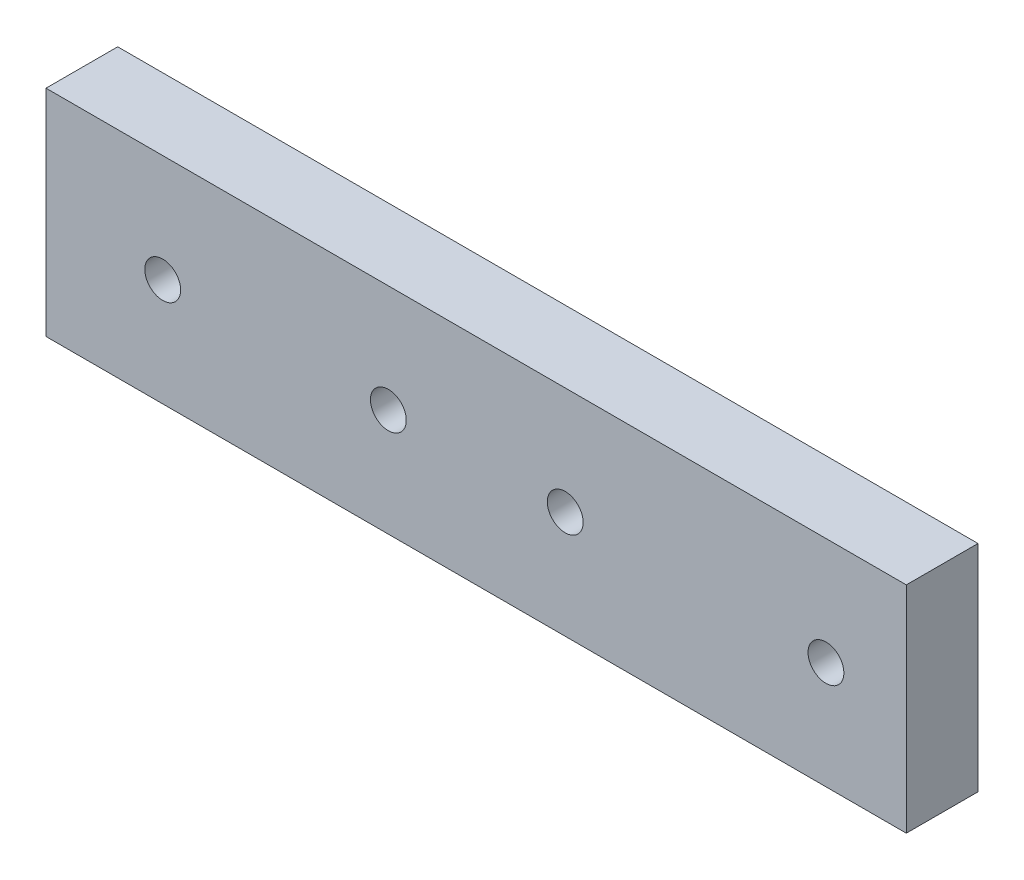
ISO-10303-21;
HEADER;
FILE_DESCRIPTION(('STEP AP214'),'2;1');
FILE_NAME('part.step','',(''),(''),'','','');
FILE_SCHEMA(('AUTOMOTIVE_DESIGN { 1 0 10303 214 1 1 1 1 }'));
ENDSEC;
DATA;
#1=APPLICATION_CONTEXT('core data for automotive mechanical design processes');
#2=APPLICATION_PROTOCOL_DEFINITION('international standard','automotive_design',2000,#1);
#3=PRODUCT_CONTEXT('',#1,'mechanical');
#4=PRODUCT('Part','Part','',(#3));
#5=PRODUCT_RELATED_PRODUCT_CATEGORY('part','',(#4));
#6=PRODUCT_DEFINITION_FORMATION('','',#4);
#7=PRODUCT_DEFINITION_CONTEXT('part definition',#1,'design');
#8=PRODUCT_DEFINITION('design','',#6,#7);
#9=PRODUCT_DEFINITION_SHAPE('','',#8);
#10=(LENGTH_UNIT() NAMED_UNIT(*) SI_UNIT(.MILLI.,.METRE.));
#11=(NAMED_UNIT(*) PLANE_ANGLE_UNIT() SI_UNIT($,.RADIAN.));
#12=(NAMED_UNIT(*) SI_UNIT($,.STERADIAN.) SOLID_ANGLE_UNIT());
#13=UNCERTAINTY_MEASURE_WITH_UNIT(LENGTH_MEASURE(1.E-05),#10,'distance_accuracy_value','');
#14=(GEOMETRIC_REPRESENTATION_CONTEXT(3) GLOBAL_UNCERTAINTY_ASSIGNED_CONTEXT((#13)) GLOBAL_UNIT_ASSIGNED_CONTEXT((#10,
#11,#12)) REPRESENTATION_CONTEXT('',''));
#15=CARTESIAN_POINT('',(0.,0.,0.));
#16=DIRECTION('',(0.,0.,1.));
#17=DIRECTION('',(1.,0.,0.));
#18=AXIS2_PLACEMENT_3D('',#15,#16,#17);
#19=CARTESIAN_POINT('',(-6.70657386989236,15.,40.));
#20=DIRECTION('',(0.,0.,-1.));
#21=DIRECTION('',(-1.,0.,0.));
#22=AXIS2_PLACEMENT_3D('',#19,#20,#21);
#23=CYLINDRICAL_SURFACE('',#22,2.5);
#24=CARTESIAN_POINT('',(-6.70657386989238,15.,-17.5));
#25=DIRECTION('',(0.,0.,-1.));
#26=DIRECTION('',(-1.,0.,0.));
#27=AXIS2_PLACEMENT_3D('',#24,#25,#26);
#28=CIRCLE('',#27,2.5);
#29=CARTESIAN_POINT('',(-9.20657386989238,15.,-17.5));
#30=VERTEX_POINT('',#29);
#31=EDGE_CURVE('E447',#30,#30,#28,.T.);
#32=ORIENTED_EDGE('',*,*,#31,.F.);
#33=EDGE_LOOP('',(#32));
#34=FACE_BOUND('',#33,.T.);
#35=CARTESIAN_POINT('',(-6.70657386989239,15.,-24.5));
#36=DIRECTION('',(0.,0.,-1.));
#37=DIRECTION('',(-1.,0.,0.));
#38=AXIS2_PLACEMENT_3D('',#35,#36,#37);
#39=CIRCLE('',#38,2.5);
#40=CARTESIAN_POINT('',(-9.20657386989239,15.,-24.5));
#41=VERTEX_POINT('',#40);
#42=EDGE_CURVE('E37',#41,#41,#39,.F.);
#43=ORIENTED_EDGE('',*,*,#42,.F.);
#44=EDGE_LOOP('',(#43));
#45=FACE_BOUND('',#44,.T.);
#46=ADVANCED_FACE('F33',(#34,#45),#23,.F.);
#47=CARTESIAN_POINT('',(-99.2164026591733,15.,40.));
#48=DIRECTION('',(0.,0.,-1.));
#49=DIRECTION('',(-1.,0.,0.));
#50=AXIS2_PLACEMENT_3D('',#47,#48,#49);
#51=CYLINDRICAL_SURFACE('',#50,2.5);
#52=CARTESIAN_POINT('',(-99.2164026591733,15.,-17.5));
#53=DIRECTION('',(0.,0.,-1.));
#54=DIRECTION('',(-1.,0.,0.));
#55=AXIS2_PLACEMENT_3D('',#52,#53,#54);
#56=CIRCLE('',#55,2.5);
#57=CARTESIAN_POINT('',(-101.716402659173,15.,-17.5));
#58=VERTEX_POINT('',#57);
#59=EDGE_CURVE('E450',#58,#58,#56,.T.);
#60=ORIENTED_EDGE('',*,*,#59,.F.);
#61=EDGE_LOOP('',(#60));
#62=FACE_BOUND('',#61,.T.);
#63=CARTESIAN_POINT('',(-99.2164026591734,15.,-24.5));
#64=DIRECTION('',(0.,0.,-1.));
#65=DIRECTION('',(-1.,0.,0.));
#66=AXIS2_PLACEMENT_3D('',#63,#64,#65);
#67=CIRCLE('',#66,2.5);
#68=CARTESIAN_POINT('',(-101.716402659173,15.,-24.5));
#69=VERTEX_POINT('',#68);
#70=EDGE_CURVE('E462',#69,#69,#67,.F.);
#71=ORIENTED_EDGE('',*,*,#70,.F.);
#72=EDGE_LOOP('',(#71));
#73=FACE_BOUND('',#72,.T.);
#74=ADVANCED_FACE('F472',(#62,#73),#51,.F.);
#75=CARTESIAN_POINT('',(-67.7461410245669,15.,40.));
#76=DIRECTION('',(0.,0.,-1.));
#77=DIRECTION('',(-1.,0.,0.));
#78=AXIS2_PLACEMENT_3D('',#75,#76,#77);
#79=CYLINDRICAL_SURFACE('',#78,2.50000000000001);
#80=CARTESIAN_POINT('',(-67.7461410245669,15.,-17.5));
#81=DIRECTION('',(0.,0.,-1.));
#82=DIRECTION('',(-1.,0.,0.));
#83=AXIS2_PLACEMENT_3D('',#80,#81,#82);
#84=CIRCLE('',#83,2.50000000000001);
#85=CARTESIAN_POINT('',(-70.2461410245669,15.,-17.5));
#86=VERTEX_POINT('',#85);
#87=EDGE_CURVE('E453',#86,#86,#84,.T.);
#88=ORIENTED_EDGE('',*,*,#87,.F.);
#89=EDGE_LOOP('',(#88));
#90=FACE_BOUND('',#89,.T.);
#91=CARTESIAN_POINT('',(-67.7461410245669,15.,-24.5));
#92=DIRECTION('',(0.,0.,-1.));
#93=DIRECTION('',(-1.,0.,0.));
#94=AXIS2_PLACEMENT_3D('',#91,#92,#93);
#95=CIRCLE('',#94,2.50000000000001);
#96=CARTESIAN_POINT('',(-70.2461410245669,15.,-24.5));
#97=VERTEX_POINT('',#96);
#98=EDGE_CURVE('E460',#97,#97,#95,.F.);
#99=ORIENTED_EDGE('',*,*,#98,.F.);
#100=EDGE_LOOP('',(#99));
#101=FACE_BOUND('',#100,.T.);
#102=ADVANCED_FACE('F478',(#90,#101),#79,.F.);
#103=CARTESIAN_POINT('',(-43.0740192619808,15.,40.));
#104=DIRECTION('',(0.,0.,-1.));
#105=DIRECTION('',(-1.,0.,0.));
#106=AXIS2_PLACEMENT_3D('',#103,#104,#105);
#107=CYLINDRICAL_SURFACE('',#106,2.5);
#108=CARTESIAN_POINT('',(-43.0740192619808,15.,-17.5));
#109=DIRECTION('',(0.,0.,-1.));
#110=DIRECTION('',(-1.,0.,0.));
#111=AXIS2_PLACEMENT_3D('',#108,#109,#110);
#112=CIRCLE('',#111,2.5);
#113=CARTESIAN_POINT('',(-45.5740192619808,15.,-17.5));
#114=VERTEX_POINT('',#113);
#115=EDGE_CURVE('E435',#114,#114,#112,.T.);
#116=ORIENTED_EDGE('',*,*,#115,.F.);
#117=EDGE_LOOP('',(#116));
#118=FACE_BOUND('',#117,.T.);
#119=CARTESIAN_POINT('',(-43.0740192619808,15.,-24.5));
#120=DIRECTION('',(0.,0.,-1.));
#121=DIRECTION('',(-1.,0.,0.));
#122=AXIS2_PLACEMENT_3D('',#119,#120,#121);
#123=CIRCLE('',#122,2.5);
#124=CARTESIAN_POINT('',(-45.5740192619808,15.,-24.5));
#125=VERTEX_POINT('',#124);
#126=EDGE_CURVE('E409',#125,#125,#123,.F.);
#127=ORIENTED_EDGE('',*,*,#126,.F.);
#128=EDGE_LOOP('',(#127));
#129=FACE_BOUND('',#128,.T.);
#130=ADVANCED_FACE('F506',(#118,#129),#107,.F.);
#131=CARTESIAN_POINT('',(-115.498945947558,0.,-27.5));
#132=DIRECTION('',(1.,0.,0.));
#133=DIRECTION('',(0.,0.,-1.));
#134=AXIS2_PLACEMENT_3D('',#131,#132,#133);
#135=PLANE('',#134);
#136=DIRECTION('',(0.,1.,0.));
#137=VECTOR('',#136,1.);
#138=CARTESIAN_POINT('',(-115.498945947558,0.,-17.5));
#139=LINE('',#138,#137);
#140=CARTESIAN_POINT('',(-115.498945947558,0.,-17.5));
#141=VERTEX_POINT('',#140);
#142=CARTESIAN_POINT('',(-115.498945947558,30.,-17.5));
#143=VERTEX_POINT('',#142);
#144=EDGE_CURVE('E431',#141,#143,#139,.T.);
#145=ORIENTED_EDGE('',*,*,#144,.T.);
#146=DIRECTION('',(0.,0.,1.));
#147=VECTOR('',#146,1.);
#148=CARTESIAN_POINT('',(-115.498945947558,30.,-27.5));
#149=LINE('',#148,#147);
#150=CARTESIAN_POINT('',(-115.498945947558,30.,-27.5));
#151=VERTEX_POINT('',#150);
#152=EDGE_CURVE('E11',#151,#143,#149,.T.);
#153=ORIENTED_EDGE('',*,*,#152,.F.);
#154=DIRECTION('',(0.,1.,0.));
#155=VECTOR('',#154,1.);
#156=CARTESIAN_POINT('',(-115.498945947558,0.,-27.5));
#157=LINE('',#156,#155);
#158=CARTESIAN_POINT('',(-115.498945947558,0.,-27.5));
#159=VERTEX_POINT('',#158);
#160=EDGE_CURVE('E420',#159,#151,#157,.T.);
#161=ORIENTED_EDGE('',*,*,#160,.F.);
#162=DIRECTION('',(0.,0.,1.));
#163=VECTOR('',#162,1.);
#164=CARTESIAN_POINT('',(-115.498945947558,0.,-27.5));
#165=LINE('',#164,#163);
#166=EDGE_CURVE('E430',#159,#141,#165,.T.);
#167=ORIENTED_EDGE('',*,*,#166,.T.);
#168=EDGE_LOOP('',(#145,#153,#161,#167));
#169=FACE_BOUND('',#168,.T.);
#170=ADVANCED_FACE('F35',(#169),#135,.F.);
#171=CARTESIAN_POINT('',(-115.498945947558,30.,-27.5));
#172=DIRECTION('',(0.,-1.,0.));
#173=DIRECTION('',(0.,0.,-1.));
#174=AXIS2_PLACEMENT_3D('',#171,#172,#173);
#175=PLANE('',#174);
#176=DIRECTION('',(1.,0.,0.));
#177=VECTOR('',#176,1.);
#178=CARTESIAN_POINT('',(-115.498945947558,30.,-17.5));
#179=LINE('',#178,#177);
#180=CARTESIAN_POINT('',(4.50105405244177,30.,-17.5));
#181=VERTEX_POINT('',#180);
#182=EDGE_CURVE('E434',#143,#181,#179,.T.);
#183=ORIENTED_EDGE('',*,*,#182,.T.);
#184=DIRECTION('',(0.,0.,1.));
#185=VECTOR('',#184,1.);
#186=CARTESIAN_POINT('',(4.50105405244176,30.,-27.5));
#187=LINE('',#186,#185);
#188=CARTESIAN_POINT('',(4.50105405244176,30.,-27.5));
#189=VERTEX_POINT('',#188);
#190=EDGE_CURVE('E42',#189,#181,#187,.T.);
#191=ORIENTED_EDGE('',*,*,#190,.F.);
#192=DIRECTION('',(1.,0.,0.));
#193=VECTOR('',#192,1.);
#194=CARTESIAN_POINT('',(-115.498945947558,30.,-27.5));
#195=LINE('',#194,#193);
#196=EDGE_CURVE('E423',#151,#189,#195,.T.);
#197=ORIENTED_EDGE('',*,*,#196,.F.);
#198=ORIENTED_EDGE('',*,*,#152,.T.);
#199=EDGE_LOOP('',(#183,#191,#197,#198));
#200=FACE_BOUND('',#199,.T.);
#201=ADVANCED_FACE('F499',(#200),#175,.F.);
#202=CARTESIAN_POINT('',(4.50105405244176,30.,-27.5));
#203=DIRECTION('',(-1.,0.,0.));
#204=DIRECTION('',(0.,0.,1.));
#205=AXIS2_PLACEMENT_3D('',#202,#203,#204);
#206=PLANE('',#205);
#207=DIRECTION('',(0.,-1.,0.));
#208=VECTOR('',#207,1.);
#209=CARTESIAN_POINT('',(4.50105405244177,30.,-17.5));
#210=LINE('',#209,#208);
#211=CARTESIAN_POINT('',(4.50105405244177,0.,-17.5));
#212=VERTEX_POINT('',#211);
#213=EDGE_CURVE('E437',#181,#212,#210,.T.);
#214=ORIENTED_EDGE('',*,*,#213,.T.);
#215=DIRECTION('',(0.,0.,1.));
#216=VECTOR('',#215,1.);
#217=CARTESIAN_POINT('',(4.50105405244176,0.,-27.5));
#218=LINE('',#217,#216);
#219=CARTESIAN_POINT('',(4.50105405244176,0.,-27.5));
#220=VERTEX_POINT('',#219);
#221=EDGE_CURVE('E442',#220,#212,#218,.T.);
#222=ORIENTED_EDGE('',*,*,#221,.F.);
#223=DIRECTION('',(0.,-1.,0.));
#224=VECTOR('',#223,1.);
#225=CARTESIAN_POINT('',(4.50105405244176,30.,-27.5));
#226=LINE('',#225,#224);
#227=EDGE_CURVE('E426',#189,#220,#226,.T.);
#228=ORIENTED_EDGE('',*,*,#227,.F.);
#229=ORIENTED_EDGE('',*,*,#190,.T.);
#230=EDGE_LOOP('',(#214,#222,#228,#229));
#231=FACE_BOUND('',#230,.T.);
#232=ADVANCED_FACE('F496',(#231),#206,.F.);
#233=CARTESIAN_POINT('',(4.50105405244176,0.,-27.5));
#234=DIRECTION('',(0.,1.,0.));
#235=DIRECTION('',(-1.,0.,0.));
#236=AXIS2_PLACEMENT_3D('',#233,#234,#235);
#237=PLANE('',#236);
#238=DIRECTION('',(-1.,0.,0.));
#239=VECTOR('',#238,1.);
#240=CARTESIAN_POINT('',(4.50105405244177,0.,-17.5));
#241=LINE('',#240,#239);
#242=EDGE_CURVE('E424',#212,#141,#241,.T.);
#243=ORIENTED_EDGE('',*,*,#242,.T.);
#244=ORIENTED_EDGE('',*,*,#166,.F.);
#245=DIRECTION('',(-1.,0.,0.));
#246=VECTOR('',#245,1.);
#247=CARTESIAN_POINT('',(4.50105405244176,0.,-27.5));
#248=LINE('',#247,#246);
#249=EDGE_CURVE('E428',#220,#159,#248,.T.);
#250=ORIENTED_EDGE('',*,*,#249,.F.);
#251=ORIENTED_EDGE('',*,*,#221,.T.);
#252=EDGE_LOOP('',(#243,#244,#250,#251));
#253=FACE_BOUND('',#252,.T.);
#254=ADVANCED_FACE('F488',(#253),#237,.F.);
#255=CARTESIAN_POINT('',(0.,0.,-27.5));
#256=DIRECTION('',(0.,0.,-1.));
#257=DIRECTION('',(-1.,0.,0.));
#258=AXIS2_PLACEMENT_3D('',#255,#256,#257);
#259=PLANE('',#258);
#260=DIRECTION('',(-1.,0.,0.));
#261=VECTOR('',#260,1.);
#262=CARTESIAN_POINT('',(-96.8492665554959,10.9,-27.5));
#263=LINE('',#262,#261);
#264=CARTESIAN_POINT('',(-96.8492665554959,10.9,-27.5));
#265=VERTEX_POINT('',#264);
#266=CARTESIAN_POINT('',(-101.583538762851,10.9,-27.5));
#267=VERTEX_POINT('',#266);
#268=EDGE_CURVE('E50',#265,#267,#263,.T.);
#269=ORIENTED_EDGE('',*,*,#268,.F.);
#270=DIRECTION('',(-0.499999999999999,-0.866025403784439,0.));
#271=VECTOR('',#270,1.);
#272=CARTESIAN_POINT('',(-94.4821304518184,15.,-27.5));
#273=LINE('',#272,#271);
#274=CARTESIAN_POINT('',(-94.4821304518184,15.,-27.5));
#275=VERTEX_POINT('',#274);
#276=EDGE_CURVE('E331',#275,#265,#273,.T.);
#277=ORIENTED_EDGE('',*,*,#276,.F.);
#278=DIRECTION('',(0.500000000000002,-0.866025403784438,0.));
#279=VECTOR('',#278,1.);
#280=CARTESIAN_POINT('',(-96.8492665554959,19.1,-27.5));
#281=LINE('',#280,#279);
#282=CARTESIAN_POINT('',(-96.8492665554959,19.1,-27.5));
#283=VERTEX_POINT('',#282);
#284=EDGE_CURVE('E357',#283,#275,#281,.T.);
#285=ORIENTED_EDGE('',*,*,#284,.F.);
#286=DIRECTION('',(1.,0.,0.));
#287=VECTOR('',#286,1.);
#288=CARTESIAN_POINT('',(-101.583538762851,19.1,-27.5));
#289=LINE('',#288,#287);
#290=CARTESIAN_POINT('',(-101.583538762851,19.1,-27.5));
#291=VERTEX_POINT('',#290);
#292=EDGE_CURVE('E354',#291,#283,#289,.T.);
#293=ORIENTED_EDGE('',*,*,#292,.F.);
#294=DIRECTION('',(0.500000000000001,0.866025403784438,0.));
#295=VECTOR('',#294,1.);
#296=CARTESIAN_POINT('',(-103.950674866528,15.,-27.5));
#297=LINE('',#296,#295);
#298=CARTESIAN_POINT('',(-103.950674866528,15.,-27.5));
#299=VERTEX_POINT('',#298);
#300=EDGE_CURVE('E351',#299,#291,#297,.T.);
#301=ORIENTED_EDGE('',*,*,#300,.F.);
#302=DIRECTION('',(-0.500000000000002,0.866025403784437,0.));
#303=VECTOR('',#302,1.);
#304=CARTESIAN_POINT('',(-101.583538762851,10.9,-27.5));
#305=LINE('',#304,#303);
#306=EDGE_CURVE('E348',#267,#299,#305,.T.);
#307=ORIENTED_EDGE('',*,*,#306,.F.);
#308=EDGE_LOOP('',(#269,#277,#285,#293,#301,#307));
#309=FACE_BOUND('',#308,.T.);
#310=DIRECTION('',(-1.,0.,0.));
#311=VECTOR('',#310,1.);
#312=CARTESIAN_POINT('',(-4.33943776621493,10.9,-27.5));
#313=LINE('',#312,#311);
#314=CARTESIAN_POINT('',(-4.33943776621493,10.9,-27.5));
#315=VERTEX_POINT('',#314);
#316=CARTESIAN_POINT('',(-9.07370997356985,10.9,-27.5));
#317=VERTEX_POINT('',#316);
#318=EDGE_CURVE('E58',#315,#317,#313,.T.);
#319=ORIENTED_EDGE('',*,*,#318,.F.);
#320=DIRECTION('',(-0.5,-0.866025403784439,0.));
#321=VECTOR('',#320,1.);
#322=CARTESIAN_POINT('',(-1.97230166253746,15.,-27.5));
#323=LINE('',#322,#321);
#324=CARTESIAN_POINT('',(-1.97230166253746,15.,-27.5));
#325=VERTEX_POINT('',#324);
#326=EDGE_CURVE('E285',#325,#315,#323,.T.);
#327=ORIENTED_EDGE('',*,*,#326,.F.);
#328=DIRECTION('',(0.500000000000001,-0.866025403784438,0.));
#329=VECTOR('',#328,1.);
#330=CARTESIAN_POINT('',(-4.33943776621493,19.1,-27.5));
#331=LINE('',#330,#329);
#332=CARTESIAN_POINT('',(-4.33943776621493,19.1,-27.5));
#333=VERTEX_POINT('',#332);
#334=EDGE_CURVE('E312',#333,#325,#331,.T.);
#335=ORIENTED_EDGE('',*,*,#334,.F.);
#336=DIRECTION('',(1.,0.,0.));
#337=VECTOR('',#336,1.);
#338=CARTESIAN_POINT('',(-9.07370997356985,19.1,-27.5));
#339=LINE('',#338,#337);
#340=CARTESIAN_POINT('',(-9.07370997356985,19.1,-27.5));
#341=VERTEX_POINT('',#340);
#342=EDGE_CURVE('E309',#341,#333,#339,.T.);
#343=ORIENTED_EDGE('',*,*,#342,.F.);
#344=DIRECTION('',(0.5,0.866025403784439,0.));
#345=VECTOR('',#344,1.);
#346=CARTESIAN_POINT('',(-11.4408460772473,15.,-27.5));
#347=LINE('',#346,#345);
#348=CARTESIAN_POINT('',(-11.4408460772473,15.,-27.5));
#349=VERTEX_POINT('',#348);
#350=EDGE_CURVE('E306',#349,#341,#347,.T.);
#351=ORIENTED_EDGE('',*,*,#350,.F.);
#352=DIRECTION('',(-0.500000000000001,0.866025403784438,0.));
#353=VECTOR('',#352,1.);
#354=CARTESIAN_POINT('',(-9.07370997356985,10.9,-27.5));
#355=LINE('',#354,#353);
#356=EDGE_CURVE('E302',#317,#349,#355,.T.);
#357=ORIENTED_EDGE('',*,*,#356,.F.);
#358=EDGE_LOOP('',(#319,#327,#335,#343,#351,#357));
#359=FACE_BOUND('',#358,.T.);
#360=DIRECTION('',(-1.,0.,0.));
#361=VECTOR('',#360,1.);
#362=CARTESIAN_POINT('',(-65.3790049208895,10.9,-27.5));
#363=LINE('',#362,#361);
#364=CARTESIAN_POINT('',(-65.3790049208895,10.9,-27.5));
#365=VERTEX_POINT('',#364);
#366=CARTESIAN_POINT('',(-70.1132771282444,10.9,-27.5));
#367=VERTEX_POINT('',#366);
#368=EDGE_CURVE('E227',#365,#367,#363,.T.);
#369=ORIENTED_EDGE('',*,*,#368,.F.);
#370=DIRECTION('',(-0.500000000000001,-0.866025403784438,0.));
#371=VECTOR('',#370,1.);
#372=CARTESIAN_POINT('',(-63.011868817212,15.,-27.5));
#373=LINE('',#372,#371);
#374=CARTESIAN_POINT('',(-63.011868817212,15.,-27.5));
#375=VERTEX_POINT('',#374);
#376=EDGE_CURVE('E246',#375,#365,#373,.T.);
#377=ORIENTED_EDGE('',*,*,#376,.F.);
#378=DIRECTION('',(0.500000000000001,-0.866025403784438,0.));
#379=VECTOR('',#378,1.);
#380=CARTESIAN_POINT('',(-65.3790049208895,19.1,-27.5));
#381=LINE('',#380,#379);
#382=CARTESIAN_POINT('',(-65.3790049208895,19.1,-27.5));
#383=VERTEX_POINT('',#382);
#384=EDGE_CURVE('E249',#383,#375,#381,.T.);
#385=ORIENTED_EDGE('',*,*,#384,.F.);
#386=DIRECTION('',(1.,0.,0.));
#387=VECTOR('',#386,1.);
#388=CARTESIAN_POINT('',(-70.1132771282443,19.1,-27.5));
#389=LINE('',#388,#387);
#390=CARTESIAN_POINT('',(-70.1132771282443,19.1,-27.5));
#391=VERTEX_POINT('',#390);
#392=EDGE_CURVE('E266',#391,#383,#389,.T.);
#393=ORIENTED_EDGE('',*,*,#392,.F.);
#394=DIRECTION('',(0.5,0.866025403784438,0.));
#395=VECTOR('',#394,1.);
#396=CARTESIAN_POINT('',(-72.4804132319218,15.,-27.5));
#397=LINE('',#396,#395);
#398=CARTESIAN_POINT('',(-72.4804132319218,15.,-27.5));
#399=VERTEX_POINT('',#398);
#400=EDGE_CURVE('E263',#399,#391,#397,.T.);
#401=ORIENTED_EDGE('',*,*,#400,.F.);
#402=DIRECTION('',(-0.5,0.866025403784439,0.));
#403=VECTOR('',#402,1.);
#404=CARTESIAN_POINT('',(-70.1132771282444,10.9,-27.5));
#405=LINE('',#404,#403);
#406=EDGE_CURVE('E260',#367,#399,#405,.T.);
#407=ORIENTED_EDGE('',*,*,#406,.F.);
#408=EDGE_LOOP('',(#369,#377,#385,#393,#401,#407));
#409=FACE_BOUND('',#408,.T.);
#410=DIRECTION('',(-1.,0.,0.));
#411=VECTOR('',#410,1.);
#412=CARTESIAN_POINT('',(-40.7068831583033,10.9,-27.5));
#413=LINE('',#412,#411);
#414=CARTESIAN_POINT('',(-40.7068831583033,10.9,-27.5));
#415=VERTEX_POINT('',#414);
#416=CARTESIAN_POINT('',(-45.4411553656583,10.9,-27.5));
#417=VERTEX_POINT('',#416);
#418=EDGE_CURVE('E273',#415,#417,#413,.T.);
#419=ORIENTED_EDGE('',*,*,#418,.F.);
#420=DIRECTION('',(-0.499999999999999,-0.866025403784439,0.));
#421=VECTOR('',#420,1.);
#422=CARTESIAN_POINT('',(-38.3397470546259,15.,-27.5));
#423=LINE('',#422,#421);
#424=CARTESIAN_POINT('',(-38.3397470546259,15.,-27.5));
#425=VERTEX_POINT('',#424);
#426=EDGE_CURVE('E376',#425,#415,#423,.T.);
#427=ORIENTED_EDGE('',*,*,#426,.F.);
#428=DIRECTION('',(0.5,-0.866025403784439,0.));
#429=VECTOR('',#428,1.);
#430=CARTESIAN_POINT('',(-40.7068831583033,19.1,-27.5));
#431=LINE('',#430,#429);
#432=CARTESIAN_POINT('',(-40.7068831583033,19.1,-27.5));
#433=VERTEX_POINT('',#432);
#434=EDGE_CURVE('E402',#433,#425,#431,.T.);
#435=ORIENTED_EDGE('',*,*,#434,.F.);
#436=DIRECTION('',(1.,0.,0.));
#437=VECTOR('',#436,1.);
#438=CARTESIAN_POINT('',(-45.4411553656583,19.1,-27.5));
#439=LINE('',#438,#437);
#440=CARTESIAN_POINT('',(-45.4411553656583,19.1,-27.5));
#441=VERTEX_POINT('',#440);
#442=EDGE_CURVE('E399',#441,#433,#439,.T.);
#443=ORIENTED_EDGE('',*,*,#442,.F.);
#444=DIRECTION('',(0.500000000000001,0.866025403784438,0.));
#445=VECTOR('',#444,1.);
#446=CARTESIAN_POINT('',(-47.8082914693357,15.,-27.5));
#447=LINE('',#446,#445);
#448=CARTESIAN_POINT('',(-47.8082914693357,15.,-27.5));
#449=VERTEX_POINT('',#448);
#450=EDGE_CURVE('E396',#449,#441,#447,.T.);
#451=ORIENTED_EDGE('',*,*,#450,.F.);
#452=DIRECTION('',(-0.5,0.866025403784438,0.));
#453=VECTOR('',#452,1.);
#454=CARTESIAN_POINT('',(-45.4411553656583,10.9,-27.5));
#455=LINE('',#454,#453);
#456=EDGE_CURVE('E393',#417,#449,#455,.T.);
#457=ORIENTED_EDGE('',*,*,#456,.F.);
#458=EDGE_LOOP('',(#419,#427,#435,#443,#451,#457));
#459=FACE_BOUND('',#458,.T.);
#460=ORIENTED_EDGE('',*,*,#160,.T.);
#461=ORIENTED_EDGE('',*,*,#196,.T.);
#462=ORIENTED_EDGE('',*,*,#227,.T.);
#463=ORIENTED_EDGE('',*,*,#249,.T.);
#464=EDGE_LOOP('',(#460,#461,#462,#463));
#465=FACE_BOUND('',#464,.T.);
#466=ADVANCED_FACE('F484',(#309,#359,#409,#459,#465),#259,.T.);
#467=CARTESIAN_POINT('',(0.,0.,-17.5));
#468=DIRECTION('',(0.,0.,-1.));
#469=DIRECTION('',(-1.,0.,0.));
#470=AXIS2_PLACEMENT_3D('',#467,#468,#469);
#471=PLANE('',#470);
#472=ORIENTED_EDGE('',*,*,#115,.T.);
#473=EDGE_LOOP('',(#472));
#474=FACE_BOUND('',#473,.T.);
#475=ORIENTED_EDGE('',*,*,#87,.T.);
#476=EDGE_LOOP('',(#475));
#477=FACE_BOUND('',#476,.T.);
#478=ORIENTED_EDGE('',*,*,#59,.T.);
#479=EDGE_LOOP('',(#478));
#480=FACE_BOUND('',#479,.T.);
#481=ORIENTED_EDGE('',*,*,#31,.T.);
#482=EDGE_LOOP('',(#481));
#483=FACE_BOUND('',#482,.T.);
#484=ORIENTED_EDGE('',*,*,#144,.F.);
#485=ORIENTED_EDGE('',*,*,#242,.F.);
#486=ORIENTED_EDGE('',*,*,#213,.F.);
#487=ORIENTED_EDGE('',*,*,#182,.F.);
#488=EDGE_LOOP('',(#484,#485,#486,#487));
#489=FACE_BOUND('',#488,.T.);
#490=ADVANCED_FACE('F487',(#474,#477,#480,#483,#489),#471,.F.);
#491=CARTESIAN_POINT('',(0.,0.,-24.5000000000001));
#492=DIRECTION('',(0.,0.,-1.));
#493=DIRECTION('',(-1.,0.,0.));
#494=AXIS2_PLACEMENT_3D('',#491,#492,#493);
#495=PLANE('',#494);
#496=DIRECTION('',(-1.,0.,0.));
#497=VECTOR('',#496,1.);
#498=CARTESIAN_POINT('',(-40.7068831583033,10.9,-24.5));
#499=LINE('',#498,#497);
#500=CARTESIAN_POINT('',(-40.7068831583033,10.9,-24.5));
#501=VERTEX_POINT('',#500);
#502=CARTESIAN_POINT('',(-45.4411553656583,10.9,-24.5));
#503=VERTEX_POINT('',#502);
#504=EDGE_CURVE('E372',#501,#503,#499,.T.);
#505=ORIENTED_EDGE('',*,*,#504,.T.);
#506=DIRECTION('',(-0.5,0.866025403784438,0.));
#507=VECTOR('',#506,1.);
#508=CARTESIAN_POINT('',(-45.4411553656583,10.9,-24.5));
#509=LINE('',#508,#507);
#510=CARTESIAN_POINT('',(-47.8082914693357,15.,-24.5));
#511=VERTEX_POINT('',#510);
#512=EDGE_CURVE('E375',#503,#511,#509,.T.);
#513=ORIENTED_EDGE('',*,*,#512,.T.);
#514=DIRECTION('',(0.500000000000001,0.866025403784438,0.));
#515=VECTOR('',#514,1.);
#516=CARTESIAN_POINT('',(-47.8082914693357,15.,-24.5));
#517=LINE('',#516,#515);
#518=CARTESIAN_POINT('',(-45.4411553656583,19.1,-24.5));
#519=VERTEX_POINT('',#518);
#520=EDGE_CURVE('E379',#511,#519,#517,.T.);
#521=ORIENTED_EDGE('',*,*,#520,.T.);
#522=DIRECTION('',(1.,0.,0.));
#523=VECTOR('',#522,1.);
#524=CARTESIAN_POINT('',(-45.4411553656583,19.1,-24.5));
#525=LINE('',#524,#523);
#526=CARTESIAN_POINT('',(-40.7068831583033,19.1,-24.5));
#527=VERTEX_POINT('',#526);
#528=EDGE_CURVE('E382',#519,#527,#525,.T.);
#529=ORIENTED_EDGE('',*,*,#528,.T.);
#530=DIRECTION('',(0.5,-0.866025403784439,0.));
#531=VECTOR('',#530,1.);
#532=CARTESIAN_POINT('',(-40.7068831583033,19.1,-24.5));
#533=LINE('',#532,#531);
#534=CARTESIAN_POINT('',(-38.3397470546259,15.,-24.5));
#535=VERTEX_POINT('',#534);
#536=EDGE_CURVE('E385',#527,#535,#533,.T.);
#537=ORIENTED_EDGE('',*,*,#536,.T.);
#538=DIRECTION('',(-0.499999999999999,-0.866025403784439,0.));
#539=VECTOR('',#538,1.);
#540=CARTESIAN_POINT('',(-38.3397470546259,15.,-24.5));
#541=LINE('',#540,#539);
#542=EDGE_CURVE('E388',#535,#501,#541,.T.);
#543=ORIENTED_EDGE('',*,*,#542,.T.);
#544=EDGE_LOOP('',(#505,#513,#521,#529,#537,#543));
#545=FACE_BOUND('',#544,.T.);
#546=ORIENTED_EDGE('',*,*,#126,.T.);
#547=EDGE_LOOP('',(#546));
#548=FACE_BOUND('',#547,.T.);
#549=ADVANCED_FACE('F492',(#545,#548),#495,.T.);
#550=CARTESIAN_POINT('',(-40.7068831583033,10.9,-24.5));
#551=DIRECTION('',(0.,-1.,0.));
#552=DIRECTION('',(0.,0.,-1.));
#553=AXIS2_PLACEMENT_3D('',#550,#551,#552);
#554=PLANE('',#553);
#555=ORIENTED_EDGE('',*,*,#418,.T.);
#556=DIRECTION('',(0.,0.,-1.));
#557=VECTOR('',#556,1.);
#558=CARTESIAN_POINT('',(-45.4411553656583,10.9,-24.5));
#559=LINE('',#558,#557);
#560=EDGE_CURVE('E391',#503,#417,#559,.T.);
#561=ORIENTED_EDGE('',*,*,#560,.F.);
#562=ORIENTED_EDGE('',*,*,#504,.F.);
#563=DIRECTION('',(0.,0.,-1.));
#564=VECTOR('',#563,1.);
#565=CARTESIAN_POINT('',(-40.7068831583033,10.9,-24.5));
#566=LINE('',#565,#564);
#567=EDGE_CURVE('E407',#501,#415,#566,.T.);
#568=ORIENTED_EDGE('',*,*,#567,.T.);
#569=EDGE_LOOP('',(#555,#561,#562,#568));
#570=FACE_BOUND('',#569,.T.);
#571=ADVANCED_FACE('F532',(#570),#554,.F.);
#572=CARTESIAN_POINT('',(-38.3397470546259,15.,-24.5));
#573=DIRECTION('',(0.866025403784439,-0.499999999999999,0.));
#574=DIRECTION('',(0.499999999999999,0.866025403784439,0.));
#575=AXIS2_PLACEMENT_3D('',#572,#573,#574);
#576=PLANE('',#575);
#577=ORIENTED_EDGE('',*,*,#426,.T.);
#578=ORIENTED_EDGE('',*,*,#567,.F.);
#579=ORIENTED_EDGE('',*,*,#542,.F.);
#580=DIRECTION('',(0.,0.,-1.));
#581=VECTOR('',#580,1.);
#582=CARTESIAN_POINT('',(-38.3397470546259,15.,-24.5));
#583=LINE('',#582,#581);
#584=EDGE_CURVE('E410',#535,#425,#583,.T.);
#585=ORIENTED_EDGE('',*,*,#584,.T.);
#586=EDGE_LOOP('',(#577,#578,#579,#585));
#587=FACE_BOUND('',#586,.T.);
#588=ADVANCED_FACE('F535',(#587),#576,.F.);
#589=CARTESIAN_POINT('',(-40.7068831583033,19.1,-24.5));
#590=DIRECTION('',(0.866025403784439,0.5,0.));
#591=DIRECTION('',(-0.5,0.866025403784439,0.));
#592=AXIS2_PLACEMENT_3D('',#589,#590,#591);
#593=PLANE('',#592);
#594=ORIENTED_EDGE('',*,*,#434,.T.);
#595=ORIENTED_EDGE('',*,*,#584,.F.);
#596=ORIENTED_EDGE('',*,*,#536,.F.);
#597=DIRECTION('',(0.,0.,-1.));
#598=VECTOR('',#597,1.);
#599=CARTESIAN_POINT('',(-40.7068831583033,19.1,-24.5));
#600=LINE('',#599,#598);
#601=EDGE_CURVE('E412',#527,#433,#600,.T.);
#602=ORIENTED_EDGE('',*,*,#601,.T.);
#603=EDGE_LOOP('',(#594,#595,#596,#602));
#604=FACE_BOUND('',#603,.T.);
#605=ADVANCED_FACE('F548',(#604),#593,.F.);
#606=CARTESIAN_POINT('',(-45.4411553656583,19.1,-24.5));
#607=DIRECTION('',(0.,1.,0.));
#608=DIRECTION('',(0.,0.,1.));
#609=AXIS2_PLACEMENT_3D('',#606,#607,#608);
#610=PLANE('',#609);
#611=ORIENTED_EDGE('',*,*,#442,.T.);
#612=ORIENTED_EDGE('',*,*,#601,.F.);
#613=ORIENTED_EDGE('',*,*,#528,.F.);
#614=DIRECTION('',(0.,0.,-1.));
#615=VECTOR('',#614,1.);
#616=CARTESIAN_POINT('',(-45.4411553656583,19.1,-24.5));
#617=LINE('',#616,#615);
#618=EDGE_CURVE('E414',#519,#441,#617,.T.);
#619=ORIENTED_EDGE('',*,*,#618,.T.);
#620=EDGE_LOOP('',(#611,#612,#613,#619));
#621=FACE_BOUND('',#620,.T.);
#622=ADVANCED_FACE('F544',(#621),#610,.F.);
#623=CARTESIAN_POINT('',(-47.8082914693357,15.,-24.5));
#624=DIRECTION('',(-0.866025403784438,0.500000000000001,0.));
#625=DIRECTION('',(-0.500000000000001,-0.866025403784438,0.));
#626=AXIS2_PLACEMENT_3D('',#623,#624,#625);
#627=PLANE('',#626);
#628=ORIENTED_EDGE('',*,*,#450,.T.);
#629=ORIENTED_EDGE('',*,*,#618,.F.);
#630=ORIENTED_EDGE('',*,*,#520,.F.);
#631=DIRECTION('',(0.,0.,-1.));
#632=VECTOR('',#631,1.);
#633=CARTESIAN_POINT('',(-47.8082914693357,15.,-24.5));
#634=LINE('',#633,#632);
#635=EDGE_CURVE('E416',#511,#449,#634,.T.);
#636=ORIENTED_EDGE('',*,*,#635,.T.);
#637=EDGE_LOOP('',(#628,#629,#630,#636));
#638=FACE_BOUND('',#637,.T.);
#639=ADVANCED_FACE('F540',(#638),#627,.F.);
#640=CARTESIAN_POINT('',(-45.4411553656583,10.9,-24.5));
#641=DIRECTION('',(-0.866025403784438,-0.5,0.));
#642=DIRECTION('',(0.5,-0.866025403784438,0.));
#643=AXIS2_PLACEMENT_3D('',#640,#641,#642);
#644=PLANE('',#643);
#645=ORIENTED_EDGE('',*,*,#456,.T.);
#646=ORIENTED_EDGE('',*,*,#635,.F.);
#647=ORIENTED_EDGE('',*,*,#512,.F.);
#648=ORIENTED_EDGE('',*,*,#560,.T.);
#649=EDGE_LOOP('',(#645,#646,#647,#648));
#650=FACE_BOUND('',#649,.T.);
#651=ADVANCED_FACE('F537',(#650),#644,.F.);
#652=CARTESIAN_POINT('',(0.,0.,-24.5));
#653=DIRECTION('',(0.,0.,-1.));
#654=DIRECTION('',(-1.,0.,0.));
#655=AXIS2_PLACEMENT_3D('',#652,#653,#654);
#656=PLANE('',#655);
#657=DIRECTION('',(-1.,0.,0.));
#658=VECTOR('',#657,1.);
#659=CARTESIAN_POINT('',(-65.3790049208895,10.9,-24.5));
#660=LINE('',#659,#658);
#661=CARTESIAN_POINT('',(-65.3790049208895,10.9,-24.5));
#662=VERTEX_POINT('',#661);
#663=CARTESIAN_POINT('',(-70.1132771282444,10.9,-24.5));
#664=VERTEX_POINT('',#663);
#665=EDGE_CURVE('E224',#662,#664,#660,.T.);
#666=ORIENTED_EDGE('',*,*,#665,.T.);
#667=DIRECTION('',(-0.5,0.866025403784439,0.));
#668=VECTOR('',#667,1.);
#669=CARTESIAN_POINT('',(-70.1132771282444,10.9,-24.5));
#670=LINE('',#669,#668);
#671=CARTESIAN_POINT('',(-72.4804132319218,15.,-24.5));
#672=VERTEX_POINT('',#671);
#673=EDGE_CURVE('E235',#664,#672,#670,.T.);
#674=ORIENTED_EDGE('',*,*,#673,.T.);
#675=DIRECTION('',(0.5,0.866025403784438,0.));
#676=VECTOR('',#675,1.);
#677=CARTESIAN_POINT('',(-72.4804132319218,15.,-24.5));
#678=LINE('',#677,#676);
#679=CARTESIAN_POINT('',(-70.1132771282443,19.1,-24.5));
#680=VERTEX_POINT('',#679);
#681=EDGE_CURVE('E240',#672,#680,#678,.T.);
#682=ORIENTED_EDGE('',*,*,#681,.T.);
#683=DIRECTION('',(1.,0.,0.));
#684=VECTOR('',#683,1.);
#685=CARTESIAN_POINT('',(-70.1132771282443,19.1,-24.5));
#686=LINE('',#685,#684);
#687=CARTESIAN_POINT('',(-65.3790049208895,19.1,-24.5));
#688=VERTEX_POINT('',#687);
#689=EDGE_CURVE('E253',#680,#688,#686,.T.);
#690=ORIENTED_EDGE('',*,*,#689,.T.);
#691=DIRECTION('',(0.500000000000001,-0.866025403784438,0.));
#692=VECTOR('',#691,1.);
#693=CARTESIAN_POINT('',(-65.3790049208895,19.1,-24.5));
#694=LINE('',#693,#692);
#695=CARTESIAN_POINT('',(-63.011868817212,15.,-24.5));
#696=VERTEX_POINT('',#695);
#697=EDGE_CURVE('E256',#688,#696,#694,.T.);
#698=ORIENTED_EDGE('',*,*,#697,.T.);
#699=DIRECTION('',(-0.500000000000001,-0.866025403784438,0.));
#700=VECTOR('',#699,1.);
#701=CARTESIAN_POINT('',(-63.011868817212,15.,-24.5));
#702=LINE('',#701,#700);
#703=EDGE_CURVE('E232',#696,#662,#702,.T.);
#704=ORIENTED_EDGE('',*,*,#703,.T.);
#705=EDGE_LOOP('',(#666,#674,#682,#690,#698,#704));
#706=FACE_BOUND('',#705,.T.);
#707=ORIENTED_EDGE('',*,*,#98,.T.);
#708=EDGE_LOOP('',(#707));
#709=FACE_BOUND('',#708,.T.);
#710=ADVANCED_FACE('F242',(#706,#709),#656,.T.);
#711=CARTESIAN_POINT('',(-65.3790049208895,10.9,-24.5));
#712=DIRECTION('',(0.,-1.,0.));
#713=DIRECTION('',(0.,0.,-1.));
#714=AXIS2_PLACEMENT_3D('',#711,#712,#713);
#715=PLANE('',#714);
#716=ORIENTED_EDGE('',*,*,#368,.T.);
#717=DIRECTION('',(0.,0.,-1.));
#718=VECTOR('',#717,1.);
#719=CARTESIAN_POINT('',(-70.1132771282444,10.9,-24.5));
#720=LINE('',#719,#718);
#721=EDGE_CURVE('E220',#664,#367,#720,.T.);
#722=ORIENTED_EDGE('',*,*,#721,.F.);
#723=ORIENTED_EDGE('',*,*,#665,.F.);
#724=DIRECTION('',(0.,0.,-1.));
#725=VECTOR('',#724,1.);
#726=CARTESIAN_POINT('',(-65.3790049208895,10.9,-24.5));
#727=LINE('',#726,#725);
#728=EDGE_CURVE('E271',#662,#365,#727,.T.);
#729=ORIENTED_EDGE('',*,*,#728,.T.);
#730=EDGE_LOOP('',(#716,#722,#723,#729));
#731=FACE_BOUND('',#730,.T.);
#732=ADVANCED_FACE('F222',(#731),#715,.F.);
#733=CARTESIAN_POINT('',(-63.011868817212,15.,-24.5));
#734=DIRECTION('',(0.866025403784438,-0.500000000000001,0.));
#735=DIRECTION('',(0.500000000000001,0.866025403784438,0.));
#736=AXIS2_PLACEMENT_3D('',#733,#734,#735);
#737=PLANE('',#736);
#738=ORIENTED_EDGE('',*,*,#376,.T.);
#739=ORIENTED_EDGE('',*,*,#728,.F.);
#740=ORIENTED_EDGE('',*,*,#703,.F.);
#741=DIRECTION('',(0.,0.,-1.));
#742=VECTOR('',#741,1.);
#743=CARTESIAN_POINT('',(-63.011868817212,15.,-24.5));
#744=LINE('',#743,#742);
#745=EDGE_CURVE('E274',#696,#375,#744,.T.);
#746=ORIENTED_EDGE('',*,*,#745,.T.);
#747=EDGE_LOOP('',(#738,#739,#740,#746));
#748=FACE_BOUND('',#747,.T.);
#749=ADVANCED_FACE('F614',(#748),#737,.F.);
#750=CARTESIAN_POINT('',(-65.3790049208895,19.1,-24.5));
#751=DIRECTION('',(0.866025403784438,0.500000000000001,0.));
#752=DIRECTION('',(-0.500000000000001,0.866025403784438,0.));
#753=AXIS2_PLACEMENT_3D('',#750,#751,#752);
#754=PLANE('',#753);
#755=ORIENTED_EDGE('',*,*,#384,.T.);
#756=ORIENTED_EDGE('',*,*,#745,.F.);
#757=ORIENTED_EDGE('',*,*,#697,.F.);
#758=DIRECTION('',(0.,0.,-1.));
#759=VECTOR('',#758,1.);
#760=CARTESIAN_POINT('',(-65.3790049208895,19.1,-24.5));
#761=LINE('',#760,#759);
#762=EDGE_CURVE('E276',#688,#383,#761,.T.);
#763=ORIENTED_EDGE('',*,*,#762,.T.);
#764=EDGE_LOOP('',(#755,#756,#757,#763));
#765=FACE_BOUND('',#764,.T.);
#766=ADVANCED_FACE('F624',(#765),#754,.F.);
#767=CARTESIAN_POINT('',(-70.1132771282443,19.1,-24.5));
#768=DIRECTION('',(0.,1.,0.));
#769=DIRECTION('',(0.,0.,1.));
#770=AXIS2_PLACEMENT_3D('',#767,#768,#769);
#771=PLANE('',#770);
#772=ORIENTED_EDGE('',*,*,#392,.T.);
#773=ORIENTED_EDGE('',*,*,#762,.F.);
#774=ORIENTED_EDGE('',*,*,#689,.F.);
#775=DIRECTION('',(0.,0.,-1.));
#776=VECTOR('',#775,1.);
#777=CARTESIAN_POINT('',(-70.1132771282443,19.1,-24.5));
#778=LINE('',#777,#776);
#779=EDGE_CURVE('E278',#680,#391,#778,.T.);
#780=ORIENTED_EDGE('',*,*,#779,.T.);
#781=EDGE_LOOP('',(#772,#773,#774,#780));
#782=FACE_BOUND('',#781,.T.);
#783=ADVANCED_FACE('F620',(#782),#771,.F.);
#784=CARTESIAN_POINT('',(-72.4804132319218,15.,-24.5));
#785=DIRECTION('',(-0.866025403784438,0.5,0.));
#786=DIRECTION('',(-0.5,-0.866025403784439,0.));
#787=AXIS2_PLACEMENT_3D('',#784,#785,#786);
#788=PLANE('',#787);
#789=ORIENTED_EDGE('',*,*,#400,.T.);
#790=ORIENTED_EDGE('',*,*,#779,.F.);
#791=ORIENTED_EDGE('',*,*,#681,.F.);
#792=DIRECTION('',(0.,0.,-1.));
#793=VECTOR('',#792,1.);
#794=CARTESIAN_POINT('',(-72.4804132319218,15.,-24.5));
#795=LINE('',#794,#793);
#796=EDGE_CURVE('E231',#672,#399,#795,.T.);
#797=ORIENTED_EDGE('',*,*,#796,.T.);
#798=EDGE_LOOP('',(#789,#790,#791,#797));
#799=FACE_BOUND('',#798,.T.);
#800=ADVANCED_FACE('F617',(#799),#788,.F.);
#801=CARTESIAN_POINT('',(-70.1132771282444,10.9,-24.5));
#802=DIRECTION('',(-0.866025403784439,-0.5,0.));
#803=DIRECTION('',(0.5,-0.866025403784439,0.));
#804=AXIS2_PLACEMENT_3D('',#801,#802,#803);
#805=PLANE('',#804);
#806=ORIENTED_EDGE('',*,*,#406,.T.);
#807=ORIENTED_EDGE('',*,*,#796,.F.);
#808=ORIENTED_EDGE('',*,*,#673,.F.);
#809=ORIENTED_EDGE('',*,*,#721,.T.);
#810=EDGE_LOOP('',(#806,#807,#808,#809));
#811=FACE_BOUND('',#810,.T.);
#812=ADVANCED_FACE('F236',(#811),#805,.F.);
#813=CARTESIAN_POINT('',(0.,0.,-24.5));
#814=DIRECTION('',(0.,0.,-1.));
#815=DIRECTION('',(-1.,0.,0.));
#816=AXIS2_PLACEMENT_3D('',#813,#814,#815);
#817=PLANE('',#816);
#818=DIRECTION('',(-1.,0.,0.));
#819=VECTOR('',#818,1.);
#820=CARTESIAN_POINT('',(-96.8492665554959,10.9,-24.5));
#821=LINE('',#820,#819);
#822=CARTESIAN_POINT('',(-96.8492665554959,10.9,-24.5));
#823=VERTEX_POINT('',#822);
#824=CARTESIAN_POINT('',(-101.583538762851,10.9,-24.5));
#825=VERTEX_POINT('',#824);
#826=EDGE_CURVE('E327',#823,#825,#821,.T.);
#827=ORIENTED_EDGE('',*,*,#826,.T.);
#828=DIRECTION('',(-0.500000000000002,0.866025403784437,0.));
#829=VECTOR('',#828,1.);
#830=CARTESIAN_POINT('',(-101.583538762851,10.9,-24.5));
#831=LINE('',#830,#829);
#832=CARTESIAN_POINT('',(-103.950674866528,15.,-24.5));
#833=VERTEX_POINT('',#832);
#834=EDGE_CURVE('E330',#825,#833,#831,.T.);
#835=ORIENTED_EDGE('',*,*,#834,.T.);
#836=DIRECTION('',(0.500000000000001,0.866025403784438,0.));
#837=VECTOR('',#836,1.);
#838=CARTESIAN_POINT('',(-103.950674866528,15.,-24.5));
#839=LINE('',#838,#837);
#840=CARTESIAN_POINT('',(-101.583538762851,19.1,-24.5));
#841=VERTEX_POINT('',#840);
#842=EDGE_CURVE('E334',#833,#841,#839,.T.);
#843=ORIENTED_EDGE('',*,*,#842,.T.);
#844=DIRECTION('',(1.,0.,0.));
#845=VECTOR('',#844,1.);
#846=CARTESIAN_POINT('',(-101.583538762851,19.1,-24.5));
#847=LINE('',#846,#845);
#848=CARTESIAN_POINT('',(-96.8492665554959,19.1,-24.5));
#849=VERTEX_POINT('',#848);
#850=EDGE_CURVE('E337',#841,#849,#847,.T.);
#851=ORIENTED_EDGE('',*,*,#850,.T.);
#852=DIRECTION('',(0.500000000000002,-0.866025403784438,0.));
#853=VECTOR('',#852,1.);
#854=CARTESIAN_POINT('',(-96.8492665554959,19.1,-24.5));
#855=LINE('',#854,#853);
#856=CARTESIAN_POINT('',(-94.4821304518184,15.,-24.5));
#857=VERTEX_POINT('',#856);
#858=EDGE_CURVE('E340',#849,#857,#855,.T.);
#859=ORIENTED_EDGE('',*,*,#858,.T.);
#860=DIRECTION('',(-0.499999999999999,-0.866025403784439,0.));
#861=VECTOR('',#860,1.);
#862=CARTESIAN_POINT('',(-94.4821304518184,15.,-24.5));
#863=LINE('',#862,#861);
#864=EDGE_CURVE('E343',#857,#823,#863,.T.);
#865=ORIENTED_EDGE('',*,*,#864,.T.);
#866=EDGE_LOOP('',(#827,#835,#843,#851,#859,#865));
#867=FACE_BOUND('',#866,.T.);
#868=ORIENTED_EDGE('',*,*,#70,.T.);
#869=EDGE_LOOP('',(#868));
#870=FACE_BOUND('',#869,.T.);
#871=ADVANCED_FACE('F563',(#867,#870),#817,.T.);
#872=CARTESIAN_POINT('',(-96.8492665554959,10.9,-24.5));
#873=DIRECTION('',(0.,-1.,0.));
#874=DIRECTION('',(1.,0.,0.));
#875=AXIS2_PLACEMENT_3D('',#872,#873,#874);
#876=PLANE('',#875);
#877=ORIENTED_EDGE('',*,*,#268,.T.);
#878=DIRECTION('',(0.,0.,-1.));
#879=VECTOR('',#878,1.);
#880=CARTESIAN_POINT('',(-101.583538762851,10.9,-24.5));
#881=LINE('',#880,#879);
#882=EDGE_CURVE('E346',#825,#267,#881,.T.);
#883=ORIENTED_EDGE('',*,*,#882,.F.);
#884=ORIENTED_EDGE('',*,*,#826,.F.);
#885=DIRECTION('',(0.,0.,-1.));
#886=VECTOR('',#885,1.);
#887=CARTESIAN_POINT('',(-96.8492665554959,10.9,-24.5));
#888=LINE('',#887,#886);
#889=EDGE_CURVE('E303',#823,#265,#888,.T.);
#890=ORIENTED_EDGE('',*,*,#889,.T.);
#891=EDGE_LOOP('',(#877,#883,#884,#890));
#892=FACE_BOUND('',#891,.T.);
#893=ADVANCED_FACE('F559',(#892),#876,.F.);
#894=CARTESIAN_POINT('',(-94.4821304518184,15.,-24.5));
#895=DIRECTION('',(0.866025403784439,-0.499999999999999,0.));
#896=DIRECTION('',(0.499999999999999,0.866025403784439,0.));
#897=AXIS2_PLACEMENT_3D('',#894,#895,#896);
#898=PLANE('',#897);
#899=ORIENTED_EDGE('',*,*,#276,.T.);
#900=ORIENTED_EDGE('',*,*,#889,.F.);
#901=ORIENTED_EDGE('',*,*,#864,.F.);
#902=DIRECTION('',(0.,0.,-1.));
#903=VECTOR('',#902,1.);
#904=CARTESIAN_POINT('',(-94.4821304518184,15.,-24.5));
#905=LINE('',#904,#903);
#906=EDGE_CURVE('E363',#857,#275,#905,.T.);
#907=ORIENTED_EDGE('',*,*,#906,.T.);
#908=EDGE_LOOP('',(#899,#900,#901,#907));
#909=FACE_BOUND('',#908,.T.);
#910=ADVANCED_FACE('F562',(#909),#898,.F.);
#911=CARTESIAN_POINT('',(-96.8492665554959,19.1,-24.5));
#912=DIRECTION('',(0.866025403784438,0.500000000000002,0.));
#913=DIRECTION('',(-0.500000000000002,0.866025403784438,0.));
#914=AXIS2_PLACEMENT_3D('',#911,#912,#913);
#915=PLANE('',#914);
#916=ORIENTED_EDGE('',*,*,#284,.T.);
#917=ORIENTED_EDGE('',*,*,#906,.F.);
#918=ORIENTED_EDGE('',*,*,#858,.F.);
#919=DIRECTION('',(0.,0.,-1.));
#920=VECTOR('',#919,1.);
#921=CARTESIAN_POINT('',(-96.8492665554959,19.1,-24.5));
#922=LINE('',#921,#920);
#923=EDGE_CURVE('E365',#849,#283,#922,.T.);
#924=ORIENTED_EDGE('',*,*,#923,.T.);
#925=EDGE_LOOP('',(#916,#917,#918,#924));
#926=FACE_BOUND('',#925,.T.);
#927=ADVANCED_FACE('F575',(#926),#915,.F.);
#928=CARTESIAN_POINT('',(-101.583538762851,19.1,-24.5));
#929=DIRECTION('',(0.,1.,0.));
#930=DIRECTION('',(0.,0.,1.));
#931=AXIS2_PLACEMENT_3D('',#928,#929,#930);
#932=PLANE('',#931);
#933=ORIENTED_EDGE('',*,*,#292,.T.);
#934=ORIENTED_EDGE('',*,*,#923,.F.);
#935=ORIENTED_EDGE('',*,*,#850,.F.);
#936=DIRECTION('',(0.,0.,-1.));
#937=VECTOR('',#936,1.);
#938=CARTESIAN_POINT('',(-101.583538762851,19.1,-24.5));
#939=LINE('',#938,#937);
#940=EDGE_CURVE('E367',#841,#291,#939,.T.);
#941=ORIENTED_EDGE('',*,*,#940,.T.);
#942=EDGE_LOOP('',(#933,#934,#935,#941));
#943=FACE_BOUND('',#942,.T.);
#944=ADVANCED_FACE('F571',(#943),#932,.F.);
#945=CARTESIAN_POINT('',(-103.950674866528,15.,-24.5));
#946=DIRECTION('',(-0.866025403784438,0.500000000000001,0.));
#947=DIRECTION('',(-0.500000000000001,-0.866025403784438,0.));
#948=AXIS2_PLACEMENT_3D('',#945,#946,#947);
#949=PLANE('',#948);
#950=ORIENTED_EDGE('',*,*,#300,.T.);
#951=ORIENTED_EDGE('',*,*,#940,.F.);
#952=ORIENTED_EDGE('',*,*,#842,.F.);
#953=DIRECTION('',(0.,0.,-1.));
#954=VECTOR('',#953,1.);
#955=CARTESIAN_POINT('',(-103.950674866528,15.,-24.5));
#956=LINE('',#955,#954);
#957=EDGE_CURVE('E369',#833,#299,#956,.T.);
#958=ORIENTED_EDGE('',*,*,#957,.T.);
#959=EDGE_LOOP('',(#950,#951,#952,#958));
#960=FACE_BOUND('',#959,.T.);
#961=ADVANCED_FACE('F567',(#960),#949,.F.);
#962=CARTESIAN_POINT('',(-101.583538762851,10.9,-24.5));
#963=DIRECTION('',(-0.866025403784437,-0.500000000000002,0.));
#964=DIRECTION('',(0.500000000000002,-0.866025403784438,0.));
#965=AXIS2_PLACEMENT_3D('',#962,#963,#964);
#966=PLANE('',#965);
#967=ORIENTED_EDGE('',*,*,#306,.T.);
#968=ORIENTED_EDGE('',*,*,#957,.F.);
#969=ORIENTED_EDGE('',*,*,#834,.F.);
#970=ORIENTED_EDGE('',*,*,#882,.T.);
#971=EDGE_LOOP('',(#967,#968,#969,#970));
#972=FACE_BOUND('',#971,.T.);
#973=ADVANCED_FACE('F564',(#972),#966,.F.);
#974=CARTESIAN_POINT('',(0.,0.,-24.5));
#975=DIRECTION('',(0.,0.,-1.));
#976=DIRECTION('',(-1.,0.,0.));
#977=AXIS2_PLACEMENT_3D('',#974,#975,#976);
#978=PLANE('',#977);
#979=DIRECTION('',(-1.,0.,0.));
#980=VECTOR('',#979,1.);
#981=CARTESIAN_POINT('',(-4.33943776621493,10.9,-24.5));
#982=LINE('',#981,#980);
#983=CARTESIAN_POINT('',(-4.33943776621493,10.9,-24.5));
#984=VERTEX_POINT('',#983);
#985=CARTESIAN_POINT('',(-9.07370997356985,10.9,-24.5));
#986=VERTEX_POINT('',#985);
#987=EDGE_CURVE('E281',#984,#986,#982,.T.);
#988=ORIENTED_EDGE('',*,*,#987,.T.);
#989=DIRECTION('',(-0.500000000000001,0.866025403784438,0.));
#990=VECTOR('',#989,1.);
#991=CARTESIAN_POINT('',(-9.07370997356985,10.9,-24.5));
#992=LINE('',#991,#990);
#993=CARTESIAN_POINT('',(-11.4408460772473,15.,-24.5));
#994=VERTEX_POINT('',#993);
#995=EDGE_CURVE('E284',#986,#994,#992,.T.);
#996=ORIENTED_EDGE('',*,*,#995,.T.);
#997=DIRECTION('',(0.5,0.866025403784439,0.));
#998=VECTOR('',#997,1.);
#999=CARTESIAN_POINT('',(-11.4408460772473,15.,-24.5));
#1000=LINE('',#999,#998);
#1001=CARTESIAN_POINT('',(-9.07370997356985,19.1,-24.5));
#1002=VERTEX_POINT('',#1001);
#1003=EDGE_CURVE('E288',#994,#1002,#1000,.T.);
#1004=ORIENTED_EDGE('',*,*,#1003,.T.);
#1005=DIRECTION('',(1.,0.,0.));
#1006=VECTOR('',#1005,1.);
#1007=CARTESIAN_POINT('',(-9.07370997356985,19.1,-24.5));
#1008=LINE('',#1007,#1006);
#1009=CARTESIAN_POINT('',(-4.33943776621493,19.1,-24.5));
#1010=VERTEX_POINT('',#1009);
#1011=EDGE_CURVE('E291',#1002,#1010,#1008,.T.);
#1012=ORIENTED_EDGE('',*,*,#1011,.T.);
#1013=DIRECTION('',(0.500000000000001,-0.866025403784438,0.));
#1014=VECTOR('',#1013,1.);
#1015=CARTESIAN_POINT('',(-4.33943776621493,19.1,-24.5));
#1016=LINE('',#1015,#1014);
#1017=CARTESIAN_POINT('',(-1.97230166253746,15.,-24.5));
#1018=VERTEX_POINT('',#1017);
#1019=EDGE_CURVE('E294',#1010,#1018,#1016,.T.);
#1020=ORIENTED_EDGE('',*,*,#1019,.T.);
#1021=DIRECTION('',(-0.5,-0.866025403784439,0.));
#1022=VECTOR('',#1021,1.);
#1023=CARTESIAN_POINT('',(-1.97230166253746,15.,-24.5));
#1024=LINE('',#1023,#1022);
#1025=EDGE_CURVE('E297',#1018,#984,#1024,.T.);
#1026=ORIENTED_EDGE('',*,*,#1025,.T.);
#1027=EDGE_LOOP('',(#988,#996,#1004,#1012,#1020,#1026));
#1028=FACE_BOUND('',#1027,.T.);
#1029=ORIENTED_EDGE('',*,*,#42,.T.);
#1030=EDGE_LOOP('',(#1029));
#1031=FACE_BOUND('',#1030,.T.);
#1032=ADVANCED_FACE('F469',(#1028,#1031),#978,.T.);
#1033=CARTESIAN_POINT('',(-4.33943776621493,10.9,-24.5));
#1034=DIRECTION('',(0.,-1.,0.));
#1035=DIRECTION('',(0.,0.,-1.));
#1036=AXIS2_PLACEMENT_3D('',#1033,#1034,#1035);
#1037=PLANE('',#1036);
#1038=ORIENTED_EDGE('',*,*,#318,.T.);
#1039=DIRECTION('',(0.,0.,-1.));
#1040=VECTOR('',#1039,1.);
#1041=CARTESIAN_POINT('',(-9.07370997356985,10.9,-24.5));
#1042=LINE('',#1041,#1040);
#1043=EDGE_CURVE('E300',#986,#317,#1042,.T.);
#1044=ORIENTED_EDGE('',*,*,#1043,.F.);
#1045=ORIENTED_EDGE('',*,*,#987,.F.);
#1046=DIRECTION('',(0.,0.,-1.));
#1047=VECTOR('',#1046,1.);
#1048=CARTESIAN_POINT('',(-4.33943776621493,10.9,-24.5));
#1049=LINE('',#1048,#1047);
#1050=EDGE_CURVE('E261',#984,#315,#1049,.T.);
#1051=ORIENTED_EDGE('',*,*,#1050,.T.);
#1052=EDGE_LOOP('',(#1038,#1044,#1045,#1051));
#1053=FACE_BOUND('',#1052,.T.);
#1054=ADVANCED_FACE('F586',(#1053),#1037,.F.);
#1055=CARTESIAN_POINT('',(-1.97230166253746,15.,-24.5));
#1056=DIRECTION('',(0.866025403784439,-0.5,0.));
#1057=DIRECTION('',(0.5,0.866025403784439,0.));
#1058=AXIS2_PLACEMENT_3D('',#1055,#1056,#1057);
#1059=PLANE('',#1058);
#1060=ORIENTED_EDGE('',*,*,#326,.T.);
#1061=ORIENTED_EDGE('',*,*,#1050,.F.);
#1062=ORIENTED_EDGE('',*,*,#1025,.F.);
#1063=DIRECTION('',(0.,0.,-1.));
#1064=VECTOR('',#1063,1.);
#1065=CARTESIAN_POINT('',(-1.97230166253746,15.,-24.5));
#1066=LINE('',#1065,#1064);
#1067=EDGE_CURVE('E318',#1018,#325,#1066,.T.);
#1068=ORIENTED_EDGE('',*,*,#1067,.T.);
#1069=EDGE_LOOP('',(#1060,#1061,#1062,#1068));
#1070=FACE_BOUND('',#1069,.T.);
#1071=ADVANCED_FACE('F589',(#1070),#1059,.F.);
#1072=CARTESIAN_POINT('',(-4.33943776621493,19.1,-24.5));
#1073=DIRECTION('',(0.866025403784438,0.500000000000001,0.));
#1074=DIRECTION('',(-0.500000000000001,0.866025403784438,0.));
#1075=AXIS2_PLACEMENT_3D('',#1072,#1073,#1074);
#1076=PLANE('',#1075);
#1077=ORIENTED_EDGE('',*,*,#334,.T.);
#1078=ORIENTED_EDGE('',*,*,#1067,.F.);
#1079=ORIENTED_EDGE('',*,*,#1019,.F.);
#1080=DIRECTION('',(0.,0.,-1.));
#1081=VECTOR('',#1080,1.);
#1082=CARTESIAN_POINT('',(-4.33943776621493,19.1,-24.5));
#1083=LINE('',#1082,#1081);
#1084=EDGE_CURVE('E320',#1010,#333,#1083,.T.);
#1085=ORIENTED_EDGE('',*,*,#1084,.T.);
#1086=EDGE_LOOP('',(#1077,#1078,#1079,#1085));
#1087=FACE_BOUND('',#1086,.T.);
#1088=ADVANCED_FACE('F601',(#1087),#1076,.F.);
#1089=CARTESIAN_POINT('',(-9.07370997356985,19.1,-24.5));
#1090=DIRECTION('',(0.,1.,0.));
#1091=DIRECTION('',(0.,0.,1.));
#1092=AXIS2_PLACEMENT_3D('',#1089,#1090,#1091);
#1093=PLANE('',#1092);
#1094=ORIENTED_EDGE('',*,*,#342,.T.);
#1095=ORIENTED_EDGE('',*,*,#1084,.F.);
#1096=ORIENTED_EDGE('',*,*,#1011,.F.);
#1097=DIRECTION('',(0.,0.,-1.));
#1098=VECTOR('',#1097,1.);
#1099=CARTESIAN_POINT('',(-9.07370997356985,19.1,-24.5));
#1100=LINE('',#1099,#1098);
#1101=EDGE_CURVE('E322',#1002,#341,#1100,.T.);
#1102=ORIENTED_EDGE('',*,*,#1101,.T.);
#1103=EDGE_LOOP('',(#1094,#1095,#1096,#1102));
#1104=FACE_BOUND('',#1103,.T.);
#1105=ADVANCED_FACE('F597',(#1104),#1093,.F.);
#1106=CARTESIAN_POINT('',(-11.4408460772473,15.,-24.5));
#1107=DIRECTION('',(-0.866025403784439,0.5,0.));
#1108=DIRECTION('',(-0.5,-0.866025403784439,0.));
#1109=AXIS2_PLACEMENT_3D('',#1106,#1107,#1108);
#1110=PLANE('',#1109);
#1111=ORIENTED_EDGE('',*,*,#350,.T.);
#1112=ORIENTED_EDGE('',*,*,#1101,.F.);
#1113=ORIENTED_EDGE('',*,*,#1003,.F.);
#1114=DIRECTION('',(0.,0.,-1.));
#1115=VECTOR('',#1114,1.);
#1116=CARTESIAN_POINT('',(-11.4408460772473,15.,-24.5));
#1117=LINE('',#1116,#1115);
#1118=EDGE_CURVE('E324',#994,#349,#1117,.T.);
#1119=ORIENTED_EDGE('',*,*,#1118,.T.);
#1120=EDGE_LOOP('',(#1111,#1112,#1113,#1119));
#1121=FACE_BOUND('',#1120,.T.);
#1122=ADVANCED_FACE('F593',(#1121),#1110,.F.);
#1123=CARTESIAN_POINT('',(-9.07370997356985,10.9,-24.5));
#1124=DIRECTION('',(-0.866025403784438,-0.500000000000001,0.));
#1125=DIRECTION('',(0.500000000000001,-0.866025403784438,0.));
#1126=AXIS2_PLACEMENT_3D('',#1123,#1124,#1125);
#1127=PLANE('',#1126);
#1128=ORIENTED_EDGE('',*,*,#356,.T.);
#1129=ORIENTED_EDGE('',*,*,#1118,.F.);
#1130=ORIENTED_EDGE('',*,*,#995,.F.);
#1131=ORIENTED_EDGE('',*,*,#1043,.T.);
#1132=EDGE_LOOP('',(#1128,#1129,#1130,#1131));
#1133=FACE_BOUND('',#1132,.T.);
#1134=ADVANCED_FACE('F590',(#1133),#1127,.F.);
#1135=CLOSED_SHELL('',(#46,#74,#102,#130,#170,#201,#232,#254,#466,#490,#549,#571,#588,#605,#622,
#639,#651,#710,#732,#749,#766,#783,#800,#812,#871,#893,#910,#927,#944,#961,#973,#1032,#1054,
#1071,#1088,#1105,#1122,#1134));
#1136=MANIFOLD_SOLID_BREP('B2',#1135);
#1137=ADVANCED_BREP_SHAPE_REPRESENTATION('',(#18,#1136),#14);
#1138=SHAPE_DEFINITION_REPRESENTATION(#9,#1137);
ENDSEC;
END-ISO-10303-21;
